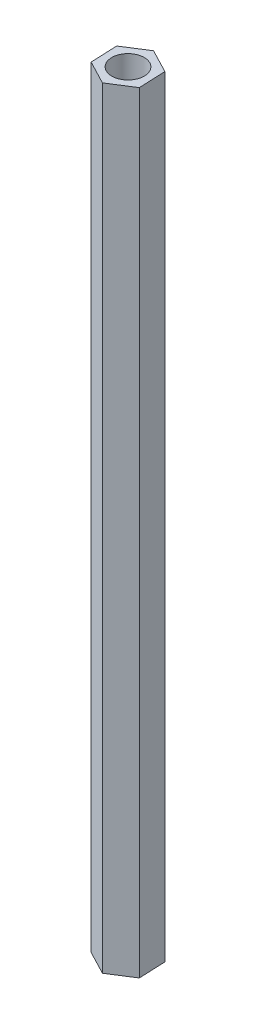
ISO-10303-21;
HEADER;
FILE_DESCRIPTION(('STEP AP214'),'2;1');
FILE_NAME('part.step','',(''),(''),'','','');
FILE_SCHEMA(('AUTOMOTIVE_DESIGN { 1 0 10303 214 1 1 1 1 }'));
ENDSEC;
DATA;
#1=APPLICATION_CONTEXT('core data for automotive mechanical design processes');
#2=APPLICATION_PROTOCOL_DEFINITION('international standard','automotive_design',2000,#1);
#3=PRODUCT_CONTEXT('',#1,'mechanical');
#4=PRODUCT('Part','Part','',(#3));
#5=PRODUCT_RELATED_PRODUCT_CATEGORY('part','',(#4));
#6=PRODUCT_DEFINITION_FORMATION('','',#4);
#7=PRODUCT_DEFINITION_CONTEXT('part definition',#1,'design');
#8=PRODUCT_DEFINITION('design','',#6,#7);
#9=PRODUCT_DEFINITION_SHAPE('','',#8);
#10=(LENGTH_UNIT() NAMED_UNIT(*) SI_UNIT(.MILLI.,.METRE.));
#11=(NAMED_UNIT(*) PLANE_ANGLE_UNIT() SI_UNIT($,.RADIAN.));
#12=(NAMED_UNIT(*) SI_UNIT($,.STERADIAN.) SOLID_ANGLE_UNIT());
#13=UNCERTAINTY_MEASURE_WITH_UNIT(LENGTH_MEASURE(1.E-05),#10,'distance_accuracy_value','');
#14=(GEOMETRIC_REPRESENTATION_CONTEXT(3) GLOBAL_UNCERTAINTY_ASSIGNED_CONTEXT((#13)) GLOBAL_UNIT_ASSIGNED_CONTEXT((#10,
#11,#12)) REPRESENTATION_CONTEXT('',''));
#15=CARTESIAN_POINT('',(0.,0.,0.));
#16=DIRECTION('',(0.,0.,1.));
#17=DIRECTION('',(1.,0.,0.));
#18=AXIS2_PLACEMENT_3D('',#15,#16,#17);
#19=CARTESIAN_POINT('',(0.,0.,0.));
#20=DIRECTION('',(0.,1.,0.));
#21=DIRECTION('',(0.,0.,1.));
#22=AXIS2_PLACEMENT_3D('',#19,#20,#21);
#23=PLANE('',#22);
#24=DIRECTION('',(0.844060336161906,0.,-0.536248215771624));
#25=VECTOR('',#24,1.);
#26=CARTESIAN_POINT('',(0.146789260428784,0.,3.46099016367034));
#27=LINE('',#26,#25);
#28=CARTESIAN_POINT('',(0.146789260428784,0.,3.46099016367034));
#29=VERTEX_POINT('',#28);
#30=CARTESIAN_POINT('',(3.07070003420097,0.,1.60337185330111));
#31=VERTEX_POINT('',#30);
#32=EDGE_CURVE('E138',#29,#31,#27,.T.);
#33=ORIENTED_EDGE('',*,*,#32,.F.);
#34=DIRECTION('',(0.886434745673259,0.,0.462853585557231));
#35=VECTOR('',#34,1.);
#36=CARTESIAN_POINT('',(-2.92391077377218,0.,1.85761831036924));
#37=LINE('',#36,#35);
#38=CARTESIAN_POINT('',(-2.92391077377218,0.,1.85761831036924));
#39=VERTEX_POINT('',#38);
#40=EDGE_CURVE('E64',#39,#29,#37,.T.);
#41=ORIENTED_EDGE('',*,*,#40,.F.);
#42=DIRECTION('',(0.042374409511354,0.,0.999101801328856));
#43=VECTOR('',#42,1.);
#44=CARTESIAN_POINT('',(-3.07070003420097,0.,-1.60337185330111));
#45=LINE('',#44,#43);
#46=CARTESIAN_POINT('',(-3.07070003420097,0.,-1.60337185330111));
#47=VERTEX_POINT('',#46);
#48=EDGE_CURVE('E72',#47,#39,#45,.T.);
#49=ORIENTED_EDGE('',*,*,#48,.F.);
#50=DIRECTION('',(-0.844060336161905,0.,0.536248215771625));
#51=VECTOR('',#50,1.);
#52=CARTESIAN_POINT('',(-0.146789260428791,0.,-3.46099016367034));
#53=LINE('',#52,#51);
#54=CARTESIAN_POINT('',(-0.146789260428791,0.,-3.46099016367034));
#55=VERTEX_POINT('',#54);
#56=EDGE_CURVE('E144',#55,#47,#53,.T.);
#57=ORIENTED_EDGE('',*,*,#56,.F.);
#58=DIRECTION('',(-0.886434745673259,0.,-0.46285358555723));
#59=VECTOR('',#58,1.);
#60=CARTESIAN_POINT('',(2.92391077377218,0.,-1.85761831036924));
#61=LINE('',#60,#59);
#62=CARTESIAN_POINT('',(2.92391077377218,0.,-1.85761831036924));
#63=VERTEX_POINT('',#62);
#64=EDGE_CURVE('E142',#63,#55,#61,.T.);
#65=ORIENTED_EDGE('',*,*,#64,.F.);
#66=DIRECTION('',(-0.0423744095113541,0.,-0.999101801328856));
#67=VECTOR('',#66,1.);
#68=CARTESIAN_POINT('',(3.07070003420097,0.,1.60337185330111));
#69=LINE('',#68,#67);
#70=EDGE_CURVE('E140',#31,#63,#69,.T.);
#71=ORIENTED_EDGE('',*,*,#70,.F.);
#72=EDGE_LOOP('',(#33,#41,#49,#57,#65,#71));
#73=FACE_BOUND('',#72,.T.);
#74=CARTESIAN_POINT('',(0.,0.,0.));
#75=DIRECTION('',(0.,1.,0.));
#76=DIRECTION('',(0.,0.,1.));
#77=AXIS2_PLACEMENT_3D('',#74,#75,#76);
#78=CIRCLE('',#77,2.1);
#79=CARTESIAN_POINT('',(0.,0.,2.1));
#80=VERTEX_POINT('',#79);
#81=EDGE_CURVE('E135',#80,#80,#78,.T.);
#82=ORIENTED_EDGE('',*,*,#81,.T.);
#83=EDGE_LOOP('',(#82));
#84=FACE_BOUND('',#83,.T.);
#85=ADVANCED_FACE('F49',(#73,#84),#23,.F.);
#86=CARTESIAN_POINT('',(0.146789260428784,60.,3.46099016367034));
#87=DIRECTION('',(-0.536248215771624,0.,-0.844060336161906));
#88=DIRECTION('',(-0.844060336161906,0.,0.536248215771624));
#89=AXIS2_PLACEMENT_3D('',#86,#87,#88);
#90=PLANE('',#89);
#91=ORIENTED_EDGE('',*,*,#32,.T.);
#92=DIRECTION('',(0.,-1.,0.));
#93=VECTOR('',#92,1.);
#94=CARTESIAN_POINT('',(3.07070003420097,60.,1.60337185330111));
#95=LINE('',#94,#93);
#96=CARTESIAN_POINT('',(3.07070003420098,100.,1.60337185330111));
#97=VERTEX_POINT('',#96);
#98=EDGE_CURVE('E11',#97,#31,#95,.T.);
#99=ORIENTED_EDGE('',*,*,#98,.F.);
#100=DIRECTION('',(0.844060336161906,0.,-0.536248215771624));
#101=VECTOR('',#100,1.);
#102=CARTESIAN_POINT('',(1.60874464731488,100.,2.53218100848573));
#103=LINE('',#102,#101);
#104=CARTESIAN_POINT('',(0.146789260428784,100.,3.46099016367034));
#105=VERTEX_POINT('',#104);
#106=EDGE_CURVE('E112',#105,#97,#103,.T.);
#107=ORIENTED_EDGE('',*,*,#106,.F.);
#108=DIRECTION('',(0.,-1.,0.));
#109=VECTOR('',#108,1.);
#110=CARTESIAN_POINT('',(0.146789260428784,60.,3.46099016367034));
#111=LINE('',#110,#109);
#112=EDGE_CURVE('E101',#105,#29,#111,.T.);
#113=ORIENTED_EDGE('',*,*,#112,.T.);
#114=EDGE_LOOP('',(#91,#99,#107,#113));
#115=FACE_BOUND('',#114,.T.);
#116=ADVANCED_FACE('F51',(#115),#90,.F.);
#117=CARTESIAN_POINT('',(3.07070003420097,60.,1.60337185330111));
#118=DIRECTION('',(-0.999101801328856,0.,0.0423744095113541));
#119=DIRECTION('',(0.0423744095113541,0.,0.999101801328856));
#120=AXIS2_PLACEMENT_3D('',#117,#118,#119);
#121=PLANE('',#120);
#122=ORIENTED_EDGE('',*,*,#70,.T.);
#123=DIRECTION('',(0.,-1.,0.));
#124=VECTOR('',#123,1.);
#125=CARTESIAN_POINT('',(2.92391077377218,60.,-1.85761831036924));
#126=LINE('',#125,#124);
#127=CARTESIAN_POINT('',(2.92391077377218,100.,-1.85761831036924));
#128=VERTEX_POINT('',#127);
#129=EDGE_CURVE('E57',#128,#63,#126,.T.);
#130=ORIENTED_EDGE('',*,*,#129,.F.);
#131=DIRECTION('',(-0.0423744095113541,0.,-0.999101801328856));
#132=VECTOR('',#131,1.);
#133=CARTESIAN_POINT('',(2.99730540398658,100.,-0.127123228534063));
#134=LINE('',#133,#132);
#135=EDGE_CURVE('E116',#97,#128,#134,.T.);
#136=ORIENTED_EDGE('',*,*,#135,.F.);
#137=ORIENTED_EDGE('',*,*,#98,.T.);
#138=EDGE_LOOP('',(#122,#130,#136,#137));
#139=FACE_BOUND('',#138,.T.);
#140=ADVANCED_FACE('F180',(#139),#121,.F.);
#141=CARTESIAN_POINT('',(2.92391077377218,60.,-1.85761831036924));
#142=DIRECTION('',(-0.46285358555723,0.,0.886434745673259));
#143=DIRECTION('',(0.886434745673259,0.,0.46285358555723));
#144=AXIS2_PLACEMENT_3D('',#141,#142,#143);
#145=PLANE('',#144);
#146=ORIENTED_EDGE('',*,*,#64,.T.);
#147=DIRECTION('',(0.,-1.,0.));
#148=VECTOR('',#147,1.);
#149=CARTESIAN_POINT('',(-0.146789260428791,60.,-3.46099016367034));
#150=LINE('',#149,#148);
#151=CARTESIAN_POINT('',(-0.146789260428791,100.,-3.46099016367034));
#152=VERTEX_POINT('',#151);
#153=EDGE_CURVE('E151',#152,#55,#150,.T.);
#154=ORIENTED_EDGE('',*,*,#153,.F.);
#155=DIRECTION('',(-0.886434745673259,0.,-0.46285358555723));
#156=VECTOR('',#155,1.);
#157=CARTESIAN_POINT('',(1.3885607566717,100.,-2.65930423701979));
#158=LINE('',#157,#156);
#159=EDGE_CURVE('E129',#128,#152,#158,.T.);
#160=ORIENTED_EDGE('',*,*,#159,.F.);
#161=ORIENTED_EDGE('',*,*,#129,.T.);
#162=EDGE_LOOP('',(#146,#154,#160,#161));
#163=FACE_BOUND('',#162,.T.);
#164=ADVANCED_FACE('F157',(#163),#145,.F.);
#165=CARTESIAN_POINT('',(-0.146789260428791,60.,-3.46099016367034));
#166=DIRECTION('',(0.536248215771625,0.,0.844060336161905));
#167=DIRECTION('',(0.844060336161905,0.,-0.536248215771625));
#168=AXIS2_PLACEMENT_3D('',#165,#166,#167);
#169=PLANE('',#168);
#170=ORIENTED_EDGE('',*,*,#56,.T.);
#171=DIRECTION('',(0.,-1.,0.));
#172=VECTOR('',#171,1.);
#173=CARTESIAN_POINT('',(-3.07070003420097,60.,-1.60337185330111));
#174=LINE('',#173,#172);
#175=CARTESIAN_POINT('',(-3.07070003420097,100.,-1.60337185330111));
#176=VERTEX_POINT('',#175);
#177=EDGE_CURVE('E149',#176,#47,#174,.T.);
#178=ORIENTED_EDGE('',*,*,#177,.F.);
#179=DIRECTION('',(-0.844060336161905,0.,0.536248215771625));
#180=VECTOR('',#179,1.);
#181=CARTESIAN_POINT('',(-1.60874464731488,100.,-2.53218100848573));
#182=LINE('',#181,#180);
#183=EDGE_CURVE('E132',#152,#176,#182,.T.);
#184=ORIENTED_EDGE('',*,*,#183,.F.);
#185=ORIENTED_EDGE('',*,*,#153,.T.);
#186=EDGE_LOOP('',(#170,#178,#184,#185));
#187=FACE_BOUND('',#186,.T.);
#188=ADVANCED_FACE('F163',(#187),#169,.F.);
#189=CARTESIAN_POINT('',(-3.07070003420097,60.,-1.60337185330111));
#190=DIRECTION('',(0.999101801328856,0.,-0.042374409511354));
#191=DIRECTION('',(-0.042374409511354,0.,-0.999101801328856));
#192=AXIS2_PLACEMENT_3D('',#189,#190,#191);
#193=PLANE('',#192);
#194=ORIENTED_EDGE('',*,*,#48,.T.);
#195=DIRECTION('',(0.,-1.,0.));
#196=VECTOR('',#195,1.);
#197=CARTESIAN_POINT('',(-2.92391077377218,60.,1.85761831036924));
#198=LINE('',#197,#196);
#199=CARTESIAN_POINT('',(-2.92391077377218,100.,1.85761831036924));
#200=VERTEX_POINT('',#199);
#201=EDGE_CURVE('E109',#200,#39,#198,.T.);
#202=ORIENTED_EDGE('',*,*,#201,.F.);
#203=DIRECTION('',(0.042374409511354,0.,0.999101801328856));
#204=VECTOR('',#203,1.);
#205=CARTESIAN_POINT('',(-2.99730540398658,100.,0.127123228534062));
#206=LINE('',#205,#204);
#207=EDGE_CURVE('E122',#176,#200,#206,.T.);
#208=ORIENTED_EDGE('',*,*,#207,.F.);
#209=ORIENTED_EDGE('',*,*,#177,.T.);
#210=EDGE_LOOP('',(#194,#202,#208,#209));
#211=FACE_BOUND('',#210,.T.);
#212=ADVANCED_FACE('F165',(#211),#193,.F.);
#213=CARTESIAN_POINT('',(-2.92391077377218,60.,1.85761831036924));
#214=DIRECTION('',(0.462853585557231,0.,-0.886434745673259));
#215=DIRECTION('',(-0.886434745673259,0.,-0.462853585557231));
#216=AXIS2_PLACEMENT_3D('',#213,#214,#215);
#217=PLANE('',#216);
#218=ORIENTED_EDGE('',*,*,#40,.T.);
#219=ORIENTED_EDGE('',*,*,#112,.F.);
#220=DIRECTION('',(0.886434745673259,0.,0.462853585557231));
#221=VECTOR('',#220,1.);
#222=CARTESIAN_POINT('',(-1.3885607566717,100.,2.65930423701979));
#223=LINE('',#222,#221);
#224=EDGE_CURVE('E105',#200,#105,#223,.T.);
#225=ORIENTED_EDGE('',*,*,#224,.F.);
#226=ORIENTED_EDGE('',*,*,#201,.T.);
#227=EDGE_LOOP('',(#218,#219,#225,#226));
#228=FACE_BOUND('',#227,.T.);
#229=ADVANCED_FACE('F103',(#228),#217,.F.);
#230=CARTESIAN_POINT('',(0.,60.,0.));
#231=DIRECTION('',(0.,-1.,0.));
#232=DIRECTION('',(0.,0.,-1.));
#233=AXIS2_PLACEMENT_3D('',#230,#231,#232);
#234=CYLINDRICAL_SURFACE('',#233,2.1);
#235=ORIENTED_EDGE('',*,*,#81,.F.);
#236=EDGE_LOOP('',(#235));
#237=FACE_BOUND('',#236,.T.);
#238=CARTESIAN_POINT('',(0.,100.,0.));
#239=DIRECTION('',(0.,1.,0.));
#240=DIRECTION('',(0.,0.,1.));
#241=AXIS2_PLACEMENT_3D('',#238,#239,#240);
#242=CIRCLE('',#241,2.1);
#243=CARTESIAN_POINT('',(0.,100.,2.1));
#244=VERTEX_POINT('',#243);
#245=EDGE_CURVE('E123',#244,#244,#242,.F.);
#246=ORIENTED_EDGE('',*,*,#245,.F.);
#247=EDGE_LOOP('',(#246));
#248=FACE_BOUND('',#247,.T.);
#249=ADVANCED_FACE('F172',(#237,#248),#234,.F.);
#250=CARTESIAN_POINT('',(0.,100.,0.));
#251=DIRECTION('',(0.,1.,0.));
#252=DIRECTION('',(0.,0.,1.));
#253=AXIS2_PLACEMENT_3D('',#250,#251,#252);
#254=PLANE('',#253);
#255=ORIENTED_EDGE('',*,*,#245,.T.);
#256=EDGE_LOOP('',(#255));
#257=FACE_BOUND('',#256,.T.);
#258=ORIENTED_EDGE('',*,*,#224,.T.);
#259=ORIENTED_EDGE('',*,*,#106,.T.);
#260=ORIENTED_EDGE('',*,*,#135,.T.);
#261=ORIENTED_EDGE('',*,*,#159,.T.);
#262=ORIENTED_EDGE('',*,*,#183,.T.);
#263=ORIENTED_EDGE('',*,*,#207,.T.);
#264=EDGE_LOOP('',(#258,#259,#260,#261,#262,#263));
#265=FACE_BOUND('',#264,.T.);
#266=ADVANCED_FACE('F119',(#257,#265),#254,.T.);
#267=CLOSED_SHELL('',(#85,#116,#140,#164,#188,#212,#229,#249,#266));
#268=MANIFOLD_SOLID_BREP('B2',#267);
#269=ADVANCED_BREP_SHAPE_REPRESENTATION('',(#18,#268),#14);
#270=SHAPE_DEFINITION_REPRESENTATION(#9,#269);
ENDSEC;
END-ISO-10303-21;
